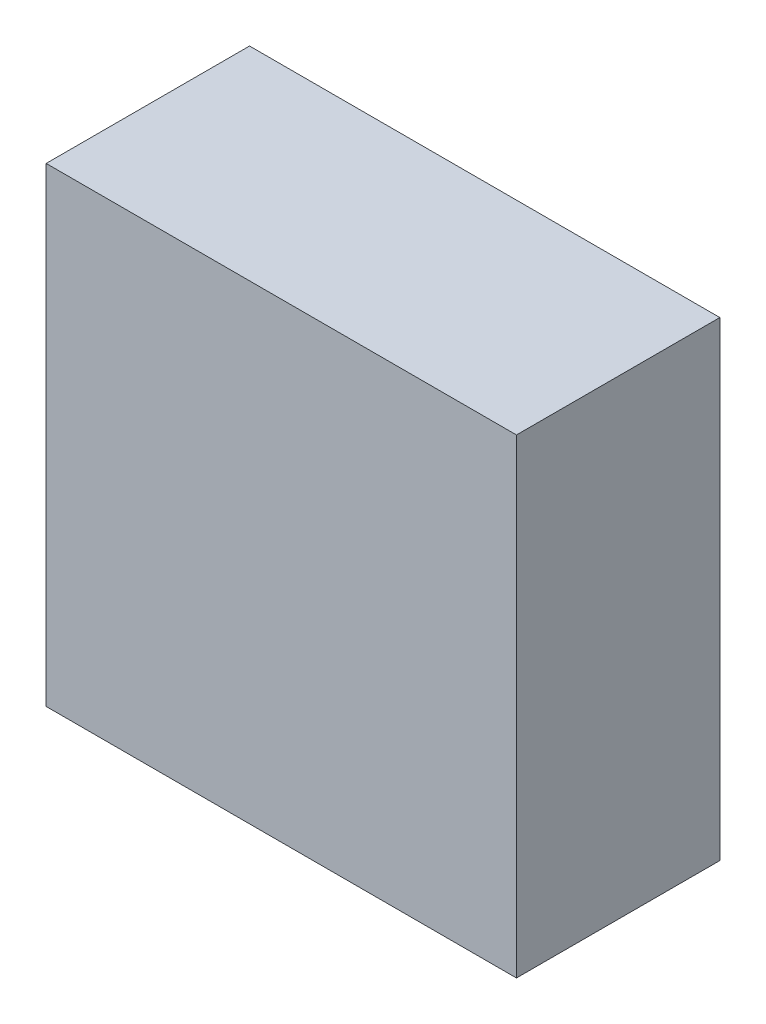
ISO-10303-21;
HEADER;
FILE_DESCRIPTION(('STEP AP214'),'2;1');
FILE_NAME('part.step','',(''),(''),'','','');
FILE_SCHEMA(('AUTOMOTIVE_DESIGN { 1 0 10303 214 1 1 1 1 }'));
ENDSEC;
DATA;
#1=APPLICATION_CONTEXT('core data for automotive mechanical design processes');
#2=APPLICATION_PROTOCOL_DEFINITION('international standard','automotive_design',2000,#1);
#3=PRODUCT_CONTEXT('',#1,'mechanical');
#4=PRODUCT('Part','Part','',(#3));
#5=PRODUCT_RELATED_PRODUCT_CATEGORY('part','',(#4));
#6=PRODUCT_DEFINITION_FORMATION('','',#4);
#7=PRODUCT_DEFINITION_CONTEXT('part definition',#1,'design');
#8=PRODUCT_DEFINITION('design','',#6,#7);
#9=PRODUCT_DEFINITION_SHAPE('','',#8);
#10=(LENGTH_UNIT() NAMED_UNIT(*) SI_UNIT(.MILLI.,.METRE.));
#11=(NAMED_UNIT(*) PLANE_ANGLE_UNIT() SI_UNIT($,.RADIAN.));
#12=(NAMED_UNIT(*) SI_UNIT($,.STERADIAN.) SOLID_ANGLE_UNIT());
#13=UNCERTAINTY_MEASURE_WITH_UNIT(LENGTH_MEASURE(1.E-05),#10,'distance_accuracy_value','');
#14=(GEOMETRIC_REPRESENTATION_CONTEXT(3) GLOBAL_UNCERTAINTY_ASSIGNED_CONTEXT((#13)) GLOBAL_UNIT_ASSIGNED_CONTEXT((#10,
#11,#12)) REPRESENTATION_CONTEXT('',''));
#15=CARTESIAN_POINT('',(0.,0.,0.));
#16=DIRECTION('',(0.,0.,1.));
#17=DIRECTION('',(1.,0.,0.));
#18=AXIS2_PLACEMENT_3D('',#15,#16,#17);
#19=CARTESIAN_POINT('',(-35.,-181.,216.5));
#20=DIRECTION('',(0.,0.,1.));
#21=DIRECTION('',(1.,0.,0.));
#22=AXIS2_PLACEMENT_3D('',#19,#20,#21);
#23=PLANE('',#22);
#24=DIRECTION('',(0.,1.,0.));
#25=VECTOR('',#24,1.);
#26=CARTESIAN_POINT('',(-35.,-181.,216.5));
#27=LINE('',#26,#25);
#28=CARTESIAN_POINT('',(-35.,-181.,216.5));
#29=VERTEX_POINT('',#28);
#30=CARTESIAN_POINT('',(-35.,-107.,216.5));
#31=VERTEX_POINT('',#30);
#32=EDGE_CURVE('E93',#29,#31,#27,.T.);
#33=ORIENTED_EDGE('',*,*,#32,.F.);
#34=DIRECTION('',(1.,0.,0.));
#35=VECTOR('',#34,1.);
#36=CARTESIAN_POINT('',(-35.,-181.,216.5));
#37=LINE('',#36,#35);
#38=CARTESIAN_POINT('',(39.,-181.,216.5));
#39=VERTEX_POINT('',#38);
#40=EDGE_CURVE('E55',#29,#39,#37,.T.);
#41=ORIENTED_EDGE('',*,*,#40,.T.);
#42=DIRECTION('',(0.,1.,0.));
#43=VECTOR('',#42,1.);
#44=CARTESIAN_POINT('',(39.,-181.,216.5));
#45=LINE('',#44,#43);
#46=CARTESIAN_POINT('',(39.,-107.,216.5));
#47=VERTEX_POINT('',#46);
#48=EDGE_CURVE('E101',#39,#47,#45,.T.);
#49=ORIENTED_EDGE('',*,*,#48,.T.);
#50=DIRECTION('',(1.,0.,0.));
#51=VECTOR('',#50,1.);
#52=CARTESIAN_POINT('',(-35.,-107.,216.5));
#53=LINE('',#52,#51);
#54=EDGE_CURVE('E9',#31,#47,#53,.T.);
#55=ORIENTED_EDGE('',*,*,#54,.F.);
#56=EDGE_LOOP('',(#33,#41,#49,#55));
#57=FACE_BOUND('',#56,.T.);
#58=ADVANCED_FACE('F14',(#57),#23,.T.);
#59=CARTESIAN_POINT('',(-35.,-181.,184.5));
#60=DIRECTION('',(0.,0.,1.));
#61=DIRECTION('',(1.,0.,0.));
#62=AXIS2_PLACEMENT_3D('',#59,#60,#61);
#63=PLANE('',#62);
#64=DIRECTION('',(1.,0.,0.));
#65=VECTOR('',#64,1.);
#66=CARTESIAN_POINT('',(-35.,-107.,184.5));
#67=LINE('',#66,#65);
#68=CARTESIAN_POINT('',(-35.,-107.,184.5));
#69=VERTEX_POINT('',#68);
#70=CARTESIAN_POINT('',(39.,-107.,184.5));
#71=VERTEX_POINT('',#70);
#72=EDGE_CURVE('E25',#69,#71,#67,.T.);
#73=ORIENTED_EDGE('',*,*,#72,.T.);
#74=DIRECTION('',(0.,1.,0.));
#75=VECTOR('',#74,1.);
#76=CARTESIAN_POINT('',(39.,-181.,184.5));
#77=LINE('',#76,#75);
#78=CARTESIAN_POINT('',(39.,-181.,184.5));
#79=VERTEX_POINT('',#78);
#80=EDGE_CURVE('E18',#79,#71,#77,.T.);
#81=ORIENTED_EDGE('',*,*,#80,.F.);
#82=DIRECTION('',(1.,0.,0.));
#83=VECTOR('',#82,1.);
#84=CARTESIAN_POINT('',(-35.,-181.,184.5));
#85=LINE('',#84,#83);
#86=CARTESIAN_POINT('',(-35.,-181.,184.5));
#87=VERTEX_POINT('',#86);
#88=EDGE_CURVE('E67',#87,#79,#85,.T.);
#89=ORIENTED_EDGE('',*,*,#88,.F.);
#90=DIRECTION('',(0.,1.,0.));
#91=VECTOR('',#90,1.);
#92=CARTESIAN_POINT('',(-35.,-181.,184.5));
#93=LINE('',#92,#91);
#94=EDGE_CURVE('E86',#87,#69,#93,.T.);
#95=ORIENTED_EDGE('',*,*,#94,.T.);
#96=EDGE_LOOP('',(#73,#81,#89,#95));
#97=FACE_BOUND('',#96,.T.);
#98=ADVANCED_FACE('F87',(#97),#63,.F.);
#99=CARTESIAN_POINT('',(-35.,-107.,184.5));
#100=DIRECTION('',(0.,1.,0.));
#101=DIRECTION('',(1.,0.,0.));
#102=AXIS2_PLACEMENT_3D('',#99,#100,#101);
#103=PLANE('',#102);
#104=ORIENTED_EDGE('',*,*,#72,.F.);
#105=DIRECTION('',(0.,0.,1.));
#106=VECTOR('',#105,1.);
#107=CARTESIAN_POINT('',(-35.,-107.,184.5));
#108=LINE('',#107,#106);
#109=EDGE_CURVE('E78',#69,#31,#108,.T.);
#110=ORIENTED_EDGE('',*,*,#109,.T.);
#111=ORIENTED_EDGE('',*,*,#54,.T.);
#112=DIRECTION('',(0.,0.,1.));
#113=VECTOR('',#112,1.);
#114=CARTESIAN_POINT('',(39.,-107.,184.5));
#115=LINE('',#114,#113);
#116=EDGE_CURVE('E81',#71,#47,#115,.T.);
#117=ORIENTED_EDGE('',*,*,#116,.F.);
#118=EDGE_LOOP('',(#104,#110,#111,#117));
#119=FACE_BOUND('',#118,.T.);
#120=ADVANCED_FACE('F76',(#119),#103,.T.);
#121=CARTESIAN_POINT('',(-35.,-181.,184.5));
#122=DIRECTION('',(0.,1.,0.));
#123=DIRECTION('',(1.,0.,0.));
#124=AXIS2_PLACEMENT_3D('',#121,#122,#123);
#125=PLANE('',#124);
#126=DIRECTION('',(0.,0.,1.));
#127=VECTOR('',#126,1.);
#128=CARTESIAN_POINT('',(39.,-181.,184.5));
#129=LINE('',#128,#127);
#130=EDGE_CURVE('E107',#79,#39,#129,.T.);
#131=ORIENTED_EDGE('',*,*,#130,.T.);
#132=ORIENTED_EDGE('',*,*,#40,.F.);
#133=DIRECTION('',(0.,0.,1.));
#134=VECTOR('',#133,1.);
#135=CARTESIAN_POINT('',(-35.,-181.,184.5));
#136=LINE('',#135,#134);
#137=EDGE_CURVE('E91',#87,#29,#136,.T.);
#138=ORIENTED_EDGE('',*,*,#137,.F.);
#139=ORIENTED_EDGE('',*,*,#88,.T.);
#140=EDGE_LOOP('',(#131,#132,#138,#139));
#141=FACE_BOUND('',#140,.T.);
#142=ADVANCED_FACE('F121',(#141),#125,.F.);
#143=CARTESIAN_POINT('',(39.,-181.,184.5));
#144=DIRECTION('',(1.,0.,0.));
#145=DIRECTION('',(0.,1.,0.));
#146=AXIS2_PLACEMENT_3D('',#143,#144,#145);
#147=PLANE('',#146);
#148=ORIENTED_EDGE('',*,*,#130,.F.);
#149=ORIENTED_EDGE('',*,*,#80,.T.);
#150=ORIENTED_EDGE('',*,*,#116,.T.);
#151=ORIENTED_EDGE('',*,*,#48,.F.);
#152=EDGE_LOOP('',(#148,#149,#150,#151));
#153=FACE_BOUND('',#152,.T.);
#154=ADVANCED_FACE('F116',(#153),#147,.T.);
#155=CARTESIAN_POINT('',(-35.,-181.,184.5));
#156=DIRECTION('',(1.,0.,0.));
#157=DIRECTION('',(0.,1.,0.));
#158=AXIS2_PLACEMENT_3D('',#155,#156,#157);
#159=PLANE('',#158);
#160=ORIENTED_EDGE('',*,*,#32,.T.);
#161=ORIENTED_EDGE('',*,*,#109,.F.);
#162=ORIENTED_EDGE('',*,*,#94,.F.);
#163=ORIENTED_EDGE('',*,*,#137,.T.);
#164=EDGE_LOOP('',(#160,#161,#162,#163));
#165=FACE_BOUND('',#164,.T.);
#166=ADVANCED_FACE('F16',(#165),#159,.F.);
#167=CLOSED_SHELL('',(#58,#98,#120,#142,#154,#166));
#168=MANIFOLD_SOLID_BREP('B1',#167);
#169=ADVANCED_BREP_SHAPE_REPRESENTATION('',(#18,#168),#14);
#170=SHAPE_DEFINITION_REPRESENTATION(#9,#169);
ENDSEC;
END-ISO-10303-21;
